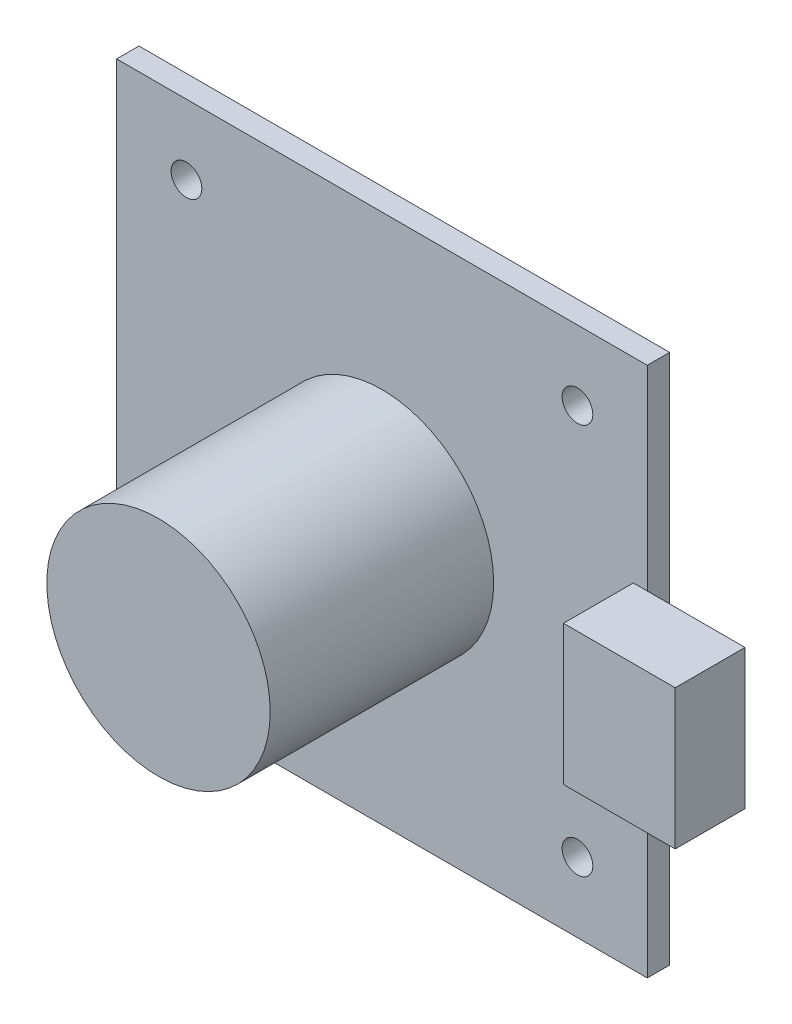
ISO-10303-21;
HEADER;
FILE_DESCRIPTION(('STEP AP214'),'2;1');
FILE_NAME('part.step','',(''),(''),'','','');
FILE_SCHEMA(('AUTOMOTIVE_DESIGN { 1 0 10303 214 1 1 1 1 }'));
ENDSEC;
DATA;
#1=APPLICATION_CONTEXT('core data for automotive mechanical design processes');
#2=APPLICATION_PROTOCOL_DEFINITION('international standard','automotive_design',2000,#1);
#3=PRODUCT_CONTEXT('',#1,'mechanical');
#4=PRODUCT('Part','Part','',(#3));
#5=PRODUCT_RELATED_PRODUCT_CATEGORY('part','',(#4));
#6=PRODUCT_DEFINITION_FORMATION('','',#4);
#7=PRODUCT_DEFINITION_CONTEXT('part definition',#1,'design');
#8=PRODUCT_DEFINITION('design','',#6,#7);
#9=PRODUCT_DEFINITION_SHAPE('','',#8);
#10=(LENGTH_UNIT() NAMED_UNIT(*) SI_UNIT(.MILLI.,.METRE.));
#11=(NAMED_UNIT(*) PLANE_ANGLE_UNIT() SI_UNIT($,.RADIAN.));
#12=(NAMED_UNIT(*) SI_UNIT($,.STERADIAN.) SOLID_ANGLE_UNIT());
#13=UNCERTAINTY_MEASURE_WITH_UNIT(LENGTH_MEASURE(1.E-05),#10,'distance_accuracy_value','');
#14=(GEOMETRIC_REPRESENTATION_CONTEXT(3) GLOBAL_UNCERTAINTY_ASSIGNED_CONTEXT((#13)) GLOBAL_UNIT_ASSIGNED_CONTEXT((#10,
#11,#12)) REPRESENTATION_CONTEXT('',''));
#15=CARTESIAN_POINT('',(0.,0.,0.));
#16=DIRECTION('',(0.,0.,1.));
#17=DIRECTION('',(1.,0.,0.));
#18=AXIS2_PLACEMENT_3D('',#15,#16,#17);
#19=CARTESIAN_POINT('',(0.,0.,1.6));
#20=DIRECTION('',(0.,0.,1.));
#21=DIRECTION('',(1.,0.,0.));
#22=AXIS2_PLACEMENT_3D('',#19,#20,#21);
#23=PLANE('',#22);
#24=CARTESIAN_POINT('',(0.,0.,1.6));
#25=DIRECTION('',(0.,0.,1.));
#26=DIRECTION('',(1.,0.,0.));
#27=AXIS2_PLACEMENT_3D('',#24,#25,#26);
#28=CIRCLE('',#27,8.);
#29=CARTESIAN_POINT('',(8.,0.,1.6));
#30=VERTEX_POINT('',#29);
#31=EDGE_CURVE('E132',#30,#30,#28,.T.);
#32=ORIENTED_EDGE('',*,*,#31,.F.);
#33=EDGE_LOOP('',(#32));
#34=FACE_BOUND('',#33,.T.);
#35=CARTESIAN_POINT('',(14.,-14.,1.6));
#36=DIRECTION('',(0.,0.,1.));
#37=DIRECTION('',(1.,0.,0.));
#38=AXIS2_PLACEMENT_3D('',#35,#36,#37);
#39=CIRCLE('',#38,1.1);
#40=CARTESIAN_POINT('',(15.1,-14.,1.6));
#41=VERTEX_POINT('',#40);
#42=EDGE_CURVE('E150',#41,#41,#39,.T.);
#43=ORIENTED_EDGE('',*,*,#42,.F.);
#44=EDGE_LOOP('',(#43));
#45=FACE_BOUND('',#44,.T.);
#46=CARTESIAN_POINT('',(-14.,-14.,1.6));
#47=DIRECTION('',(0.,0.,1.));
#48=DIRECTION('',(1.,0.,0.));
#49=AXIS2_PLACEMENT_3D('',#46,#47,#48);
#50=CIRCLE('',#49,1.1);
#51=CARTESIAN_POINT('',(-12.9,-14.,1.6));
#52=VERTEX_POINT('',#51);
#53=EDGE_CURVE('E162',#52,#52,#50,.T.);
#54=ORIENTED_EDGE('',*,*,#53,.F.);
#55=EDGE_LOOP('',(#54));
#56=FACE_BOUND('',#55,.T.);
#57=CARTESIAN_POINT('',(-14.,14.,1.6));
#58=DIRECTION('',(0.,0.,1.));
#59=DIRECTION('',(1.,0.,0.));
#60=AXIS2_PLACEMENT_3D('',#57,#58,#59);
#61=CIRCLE('',#60,1.1);
#62=CARTESIAN_POINT('',(-12.9,14.,1.6));
#63=VERTEX_POINT('',#62);
#64=EDGE_CURVE('E156',#63,#63,#61,.T.);
#65=ORIENTED_EDGE('',*,*,#64,.F.);
#66=EDGE_LOOP('',(#65));
#67=FACE_BOUND('',#66,.T.);
#68=CARTESIAN_POINT('',(14.,14.,1.6));
#69=DIRECTION('',(0.,0.,1.));
#70=DIRECTION('',(1.,0.,0.));
#71=AXIS2_PLACEMENT_3D('',#68,#69,#70);
#72=CIRCLE('',#71,1.1);
#73=CARTESIAN_POINT('',(15.1,14.,1.6));
#74=VERTEX_POINT('',#73);
#75=EDGE_CURVE('E144',#74,#74,#72,.T.);
#76=ORIENTED_EDGE('',*,*,#75,.F.);
#77=EDGE_LOOP('',(#76));
#78=FACE_BOUND('',#77,.T.);
#79=DIRECTION('',(0.,1.,0.));
#80=VECTOR('',#79,1.);
#81=CARTESIAN_POINT('',(19.,-19.,1.6));
#82=LINE('',#81,#80);
#83=CARTESIAN_POINT('',(19.,-19.,1.6));
#84=VERTEX_POINT('',#83);
#85=CARTESIAN_POINT('',(19.,-5.,1.6));
#86=VERTEX_POINT('',#85);
#87=EDGE_CURVE('E175',#84,#86,#82,.T.);
#88=ORIENTED_EDGE('',*,*,#87,.T.);
#89=DIRECTION('',(1.,0.,0.));
#90=VECTOR('',#89,1.);
#91=CARTESIAN_POINT('',(18.,-5.,1.6));
#92=LINE('',#91,#90);
#93=CARTESIAN_POINT('',(18.,-5.,1.6));
#94=VERTEX_POINT('',#93);
#95=EDGE_CURVE('E54',#94,#86,#92,.T.);
#96=ORIENTED_EDGE('',*,*,#95,.F.);
#97=DIRECTION('',(0.,-1.,0.));
#98=VECTOR('',#97,1.);
#99=CARTESIAN_POINT('',(18.,5.,1.6));
#100=LINE('',#99,#98);
#101=CARTESIAN_POINT('',(18.,5.,1.6));
#102=VERTEX_POINT('',#101);
#103=EDGE_CURVE('E59',#102,#94,#100,.T.);
#104=ORIENTED_EDGE('',*,*,#103,.F.);
#105=DIRECTION('',(-1.,0.,0.));
#106=VECTOR('',#105,1.);
#107=CARTESIAN_POINT('',(26.,5.,1.6));
#108=LINE('',#107,#106);
#109=CARTESIAN_POINT('',(19.,5.,1.6));
#110=VERTEX_POINT('',#109);
#111=EDGE_CURVE('E212',#110,#102,#108,.T.);
#112=ORIENTED_EDGE('',*,*,#111,.F.);
#113=CARTESIAN_POINT('',(19.,19.,1.6));
#114=VERTEX_POINT('',#113);
#115=EDGE_CURVE('E174',#110,#114,#82,.T.);
#116=ORIENTED_EDGE('',*,*,#115,.T.);
#117=DIRECTION('',(-1.,0.,0.));
#118=VECTOR('',#117,1.);
#119=CARTESIAN_POINT('',(19.,19.,1.6));
#120=LINE('',#119,#118);
#121=CARTESIAN_POINT('',(-19.,19.,1.6));
#122=VERTEX_POINT('',#121);
#123=EDGE_CURVE('E177',#114,#122,#120,.T.);
#124=ORIENTED_EDGE('',*,*,#123,.T.);
#125=DIRECTION('',(0.,-1.,0.));
#126=VECTOR('',#125,1.);
#127=CARTESIAN_POINT('',(-19.,19.,1.6));
#128=LINE('',#127,#126);
#129=CARTESIAN_POINT('',(-19.,-19.,1.6));
#130=VERTEX_POINT('',#129);
#131=EDGE_CURVE('E168',#122,#130,#128,.T.);
#132=ORIENTED_EDGE('',*,*,#131,.T.);
#133=DIRECTION('',(1.,0.,0.));
#134=VECTOR('',#133,1.);
#135=CARTESIAN_POINT('',(-19.,-19.,1.6));
#136=LINE('',#135,#134);
#137=EDGE_CURVE('E171',#130,#84,#136,.T.);
#138=ORIENTED_EDGE('',*,*,#137,.T.);
#139=EDGE_LOOP('',(#88,#96,#104,#112,#116,#124,#132,#138));
#140=FACE_BOUND('',#139,.T.);
#141=ADVANCED_FACE('F39',(#34,#45,#56,#67,#78,#140),#23,.T.);
#142=CARTESIAN_POINT('',(0.,0.,0.));
#143=DIRECTION('',(0.,0.,1.));
#144=DIRECTION('',(1.,0.,0.));
#145=AXIS2_PLACEMENT_3D('',#142,#143,#144);
#146=PLANE('',#145);
#147=DIRECTION('',(0.,-1.,0.));
#148=VECTOR('',#147,1.);
#149=CARTESIAN_POINT('',(-19.,19.,0.));
#150=LINE('',#149,#148);
#151=CARTESIAN_POINT('',(-19.,19.,0.));
#152=VERTEX_POINT('',#151);
#153=CARTESIAN_POINT('',(-19.,-19.,0.));
#154=VERTEX_POINT('',#153);
#155=EDGE_CURVE('E165',#152,#154,#150,.T.);
#156=ORIENTED_EDGE('',*,*,#155,.F.);
#157=DIRECTION('',(-1.,0.,0.));
#158=VECTOR('',#157,1.);
#159=CARTESIAN_POINT('',(19.,19.,0.));
#160=LINE('',#159,#158);
#161=CARTESIAN_POINT('',(19.,19.,0.));
#162=VERTEX_POINT('',#161);
#163=EDGE_CURVE('E172',#162,#152,#160,.T.);
#164=ORIENTED_EDGE('',*,*,#163,.F.);
#165=DIRECTION('',(0.,1.,0.));
#166=VECTOR('',#165,1.);
#167=CARTESIAN_POINT('',(19.,-19.,0.));
#168=LINE('',#167,#166);
#169=CARTESIAN_POINT('',(19.,-19.,0.));
#170=VERTEX_POINT('',#169);
#171=EDGE_CURVE('E185',#170,#162,#168,.T.);
#172=ORIENTED_EDGE('',*,*,#171,.F.);
#173=DIRECTION('',(1.,0.,0.));
#174=VECTOR('',#173,1.);
#175=CARTESIAN_POINT('',(-19.,-19.,0.));
#176=LINE('',#175,#174);
#177=EDGE_CURVE('E183',#154,#170,#176,.T.);
#178=ORIENTED_EDGE('',*,*,#177,.F.);
#179=EDGE_LOOP('',(#156,#164,#172,#178));
#180=FACE_BOUND('',#179,.T.);
#181=CARTESIAN_POINT('',(-14.,-14.,0.));
#182=DIRECTION('',(0.,0.,1.));
#183=DIRECTION('',(1.,0.,0.));
#184=AXIS2_PLACEMENT_3D('',#181,#182,#183);
#185=CIRCLE('',#184,1.1);
#186=CARTESIAN_POINT('',(-12.9,-14.,0.));
#187=VERTEX_POINT('',#186);
#188=EDGE_CURVE('E159',#187,#187,#185,.T.);
#189=ORIENTED_EDGE('',*,*,#188,.T.);
#190=EDGE_LOOP('',(#189));
#191=FACE_BOUND('',#190,.T.);
#192=CARTESIAN_POINT('',(-14.,14.,0.));
#193=DIRECTION('',(0.,0.,1.));
#194=DIRECTION('',(1.,0.,0.));
#195=AXIS2_PLACEMENT_3D('',#192,#193,#194);
#196=CIRCLE('',#195,1.1);
#197=CARTESIAN_POINT('',(-12.9,14.,0.));
#198=VERTEX_POINT('',#197);
#199=EDGE_CURVE('E153',#198,#198,#196,.T.);
#200=ORIENTED_EDGE('',*,*,#199,.T.);
#201=EDGE_LOOP('',(#200));
#202=FACE_BOUND('',#201,.T.);
#203=CARTESIAN_POINT('',(14.,-14.,0.));
#204=DIRECTION('',(0.,0.,1.));
#205=DIRECTION('',(1.,0.,0.));
#206=AXIS2_PLACEMENT_3D('',#203,#204,#205);
#207=CIRCLE('',#206,1.1);
#208=CARTESIAN_POINT('',(15.1,-14.,0.));
#209=VERTEX_POINT('',#208);
#210=EDGE_CURVE('E147',#209,#209,#207,.T.);
#211=ORIENTED_EDGE('',*,*,#210,.T.);
#212=EDGE_LOOP('',(#211));
#213=FACE_BOUND('',#212,.T.);
#214=CARTESIAN_POINT('',(14.,14.,0.));
#215=DIRECTION('',(0.,0.,1.));
#216=DIRECTION('',(1.,0.,0.));
#217=AXIS2_PLACEMENT_3D('',#214,#215,#216);
#218=CIRCLE('',#217,1.1);
#219=CARTESIAN_POINT('',(15.1,14.,0.));
#220=VERTEX_POINT('',#219);
#221=EDGE_CURVE('E142',#220,#220,#218,.T.);
#222=ORIENTED_EDGE('',*,*,#221,.T.);
#223=EDGE_LOOP('',(#222));
#224=FACE_BOUND('',#223,.T.);
#225=ADVANCED_FACE('F203',(#180,#191,#202,#213,#224),#146,.F.);
#226=CARTESIAN_POINT('',(-19.,19.,1.6));
#227=DIRECTION('',(1.,0.,0.));
#228=DIRECTION('',(0.,0.,-1.));
#229=AXIS2_PLACEMENT_3D('',#226,#227,#228);
#230=PLANE('',#229);
#231=ORIENTED_EDGE('',*,*,#155,.T.);
#232=DIRECTION('',(0.,0.,-1.));
#233=VECTOR('',#232,1.);
#234=CARTESIAN_POINT('',(-19.,-19.,1.6));
#235=LINE('',#234,#233);
#236=EDGE_CURVE('E11',#130,#154,#235,.T.);
#237=ORIENTED_EDGE('',*,*,#236,.F.);
#238=ORIENTED_EDGE('',*,*,#131,.F.);
#239=DIRECTION('',(0.,0.,-1.));
#240=VECTOR('',#239,1.);
#241=CARTESIAN_POINT('',(-19.,19.,1.6));
#242=LINE('',#241,#240);
#243=EDGE_CURVE('E180',#122,#152,#242,.T.);
#244=ORIENTED_EDGE('',*,*,#243,.T.);
#245=EDGE_LOOP('',(#231,#237,#238,#244));
#246=FACE_BOUND('',#245,.T.);
#247=ADVANCED_FACE('F41',(#246),#230,.F.);
#248=CARTESIAN_POINT('',(-19.,-19.,1.6));
#249=DIRECTION('',(0.,1.,0.));
#250=DIRECTION('',(0.,0.,1.));
#251=AXIS2_PLACEMENT_3D('',#248,#249,#250);
#252=PLANE('',#251);
#253=ORIENTED_EDGE('',*,*,#177,.T.);
#254=DIRECTION('',(0.,0.,-1.));
#255=VECTOR('',#254,1.);
#256=CARTESIAN_POINT('',(19.,-19.,1.6));
#257=LINE('',#256,#255);
#258=EDGE_CURVE('E47',#84,#170,#257,.T.);
#259=ORIENTED_EDGE('',*,*,#258,.F.);
#260=ORIENTED_EDGE('',*,*,#137,.F.);
#261=ORIENTED_EDGE('',*,*,#236,.T.);
#262=EDGE_LOOP('',(#253,#259,#260,#261));
#263=FACE_BOUND('',#262,.T.);
#264=ADVANCED_FACE('F260',(#263),#252,.F.);
#265=CARTESIAN_POINT('',(19.,-19.,1.6));
#266=DIRECTION('',(-1.,0.,0.));
#267=DIRECTION('',(0.,0.,1.));
#268=AXIS2_PLACEMENT_3D('',#265,#266,#267);
#269=PLANE('',#268);
#270=ORIENTED_EDGE('',*,*,#171,.T.);
#271=DIRECTION('',(0.,0.,-1.));
#272=VECTOR('',#271,1.);
#273=CARTESIAN_POINT('',(19.,19.,1.6));
#274=LINE('',#273,#272);
#275=EDGE_CURVE('E190',#114,#162,#274,.T.);
#276=ORIENTED_EDGE('',*,*,#275,.F.);
#277=ORIENTED_EDGE('',*,*,#115,.F.);
#278=EDGE_CURVE('E178',#86,#110,#82,.T.);
#279=ORIENTED_EDGE('',*,*,#278,.F.);
#280=ORIENTED_EDGE('',*,*,#87,.F.);
#281=ORIENTED_EDGE('',*,*,#258,.T.);
#282=EDGE_LOOP('',(#270,#276,#277,#279,#280,#281));
#283=FACE_BOUND('',#282,.T.);
#284=ADVANCED_FACE('F197',(#283),#269,.F.);
#285=CARTESIAN_POINT('',(19.,19.,1.6));
#286=DIRECTION('',(0.,-1.,0.));
#287=DIRECTION('',(0.,0.,-1.));
#288=AXIS2_PLACEMENT_3D('',#285,#286,#287);
#289=PLANE('',#288);
#290=ORIENTED_EDGE('',*,*,#163,.T.);
#291=ORIENTED_EDGE('',*,*,#243,.F.);
#292=ORIENTED_EDGE('',*,*,#123,.F.);
#293=ORIENTED_EDGE('',*,*,#275,.T.);
#294=EDGE_LOOP('',(#290,#291,#292,#293));
#295=FACE_BOUND('',#294,.T.);
#296=ADVANCED_FACE('F207',(#295),#289,.F.);
#297=CARTESIAN_POINT('',(-14.,-14.,1.6));
#298=DIRECTION('',(0.,0.,-1.));
#299=DIRECTION('',(-1.,0.,0.));
#300=AXIS2_PLACEMENT_3D('',#297,#298,#299);
#301=CYLINDRICAL_SURFACE('',#300,1.1);
#302=ORIENTED_EDGE('',*,*,#53,.T.);
#303=EDGE_LOOP('',(#302));
#304=FACE_BOUND('',#303,.T.);
#305=ORIENTED_EDGE('',*,*,#188,.F.);
#306=EDGE_LOOP('',(#305));
#307=FACE_BOUND('',#306,.T.);
#308=ADVANCED_FACE('F254',(#304,#307),#301,.F.);
#309=CARTESIAN_POINT('',(-14.,14.,1.6));
#310=DIRECTION('',(0.,0.,-1.));
#311=DIRECTION('',(-1.,0.,0.));
#312=AXIS2_PLACEMENT_3D('',#309,#310,#311);
#313=CYLINDRICAL_SURFACE('',#312,1.1);
#314=ORIENTED_EDGE('',*,*,#64,.T.);
#315=EDGE_LOOP('',(#314));
#316=FACE_BOUND('',#315,.T.);
#317=ORIENTED_EDGE('',*,*,#199,.F.);
#318=EDGE_LOOP('',(#317));
#319=FACE_BOUND('',#318,.T.);
#320=ADVANCED_FACE('F309',(#316,#319),#313,.F.);
#321=CARTESIAN_POINT('',(14.,-14.,1.6));
#322=DIRECTION('',(0.,0.,-1.));
#323=DIRECTION('',(-1.,0.,0.));
#324=AXIS2_PLACEMENT_3D('',#321,#322,#323);
#325=CYLINDRICAL_SURFACE('',#324,1.1);
#326=ORIENTED_EDGE('',*,*,#42,.T.);
#327=EDGE_LOOP('',(#326));
#328=FACE_BOUND('',#327,.T.);
#329=ORIENTED_EDGE('',*,*,#210,.F.);
#330=EDGE_LOOP('',(#329));
#331=FACE_BOUND('',#330,.T.);
#332=ADVANCED_FACE('F319',(#328,#331),#325,.F.);
#333=CARTESIAN_POINT('',(14.,14.,1.6));
#334=DIRECTION('',(0.,0.,-1.));
#335=DIRECTION('',(-1.,0.,0.));
#336=AXIS2_PLACEMENT_3D('',#333,#334,#335);
#337=CYLINDRICAL_SURFACE('',#336,1.1);
#338=ORIENTED_EDGE('',*,*,#75,.T.);
#339=EDGE_LOOP('',(#338));
#340=FACE_BOUND('',#339,.T.);
#341=ORIENTED_EDGE('',*,*,#221,.F.);
#342=EDGE_LOOP('',(#341));
#343=FACE_BOUND('',#342,.T.);
#344=ADVANCED_FACE('F329',(#340,#343),#337,.F.);
#345=CARTESIAN_POINT('',(0.,0.,17.6));
#346=DIRECTION('',(0.,0.,-1.));
#347=DIRECTION('',(-1.,0.,0.));
#348=AXIS2_PLACEMENT_3D('',#345,#346,#347);
#349=CYLINDRICAL_SURFACE('',#348,8.);
#350=CARTESIAN_POINT('',(0.,0.,17.6));
#351=DIRECTION('',(0.,0.,1.));
#352=DIRECTION('',(1.,0.,0.));
#353=AXIS2_PLACEMENT_3D('',#350,#351,#352);
#354=CIRCLE('',#353,8.);
#355=CARTESIAN_POINT('',(8.,0.,17.6));
#356=VERTEX_POINT('',#355);
#357=EDGE_CURVE('E135',#356,#356,#354,.T.);
#358=ORIENTED_EDGE('',*,*,#357,.F.);
#359=EDGE_LOOP('',(#358));
#360=FACE_BOUND('',#359,.T.);
#361=ORIENTED_EDGE('',*,*,#31,.T.);
#362=EDGE_LOOP('',(#361));
#363=FACE_BOUND('',#362,.T.);
#364=ADVANCED_FACE('F340',(#360,#363),#349,.T.);
#365=CARTESIAN_POINT('',(0.,0.,17.6));
#366=DIRECTION('',(0.,0.,1.));
#367=DIRECTION('',(1.,0.,0.));
#368=AXIS2_PLACEMENT_3D('',#365,#366,#367);
#369=PLANE('',#368);
#370=ORIENTED_EDGE('',*,*,#357,.T.);
#371=EDGE_LOOP('',(#370));
#372=FACE_BOUND('',#371,.T.);
#373=ADVANCED_FACE('F351',(#372),#369,.T.);
#374=CARTESIAN_POINT('',(0.,0.,1.6));
#375=DIRECTION('',(0.,0.,1.));
#376=DIRECTION('',(1.,0.,0.));
#377=AXIS2_PLACEMENT_3D('',#374,#375,#376);
#378=PLANE('',#377);
#379=CARTESIAN_POINT('',(26.,-5.,1.6));
#380=VERTEX_POINT('',#379);
#381=EDGE_CURVE('E220',#86,#380,#92,.T.);
#382=ORIENTED_EDGE('',*,*,#381,.F.);
#383=ORIENTED_EDGE('',*,*,#278,.T.);
#384=CARTESIAN_POINT('',(26.,5.,1.6));
#385=VERTEX_POINT('',#384);
#386=EDGE_CURVE('E129',#385,#110,#108,.T.);
#387=ORIENTED_EDGE('',*,*,#386,.F.);
#388=DIRECTION('',(0.,1.,0.));
#389=VECTOR('',#388,1.);
#390=CARTESIAN_POINT('',(26.,-5.,1.6));
#391=LINE('',#390,#389);
#392=EDGE_CURVE('E226',#380,#385,#391,.T.);
#393=ORIENTED_EDGE('',*,*,#392,.F.);
#394=EDGE_LOOP('',(#382,#383,#387,#393));
#395=FACE_BOUND('',#394,.T.);
#396=ADVANCED_FACE('F218',(#395),#378,.F.);
#397=CARTESIAN_POINT('',(18.,5.,6.6));
#398=DIRECTION('',(1.,0.,0.));
#399=DIRECTION('',(0.,0.,-1.));
#400=AXIS2_PLACEMENT_3D('',#397,#398,#399);
#401=PLANE('',#400);
#402=ORIENTED_EDGE('',*,*,#103,.T.);
#403=DIRECTION('',(0.,0.,-1.));
#404=VECTOR('',#403,1.);
#405=CARTESIAN_POINT('',(18.,-5.,6.6));
#406=LINE('',#405,#404);
#407=CARTESIAN_POINT('',(18.,-5.,6.6));
#408=VERTEX_POINT('',#407);
#409=EDGE_CURVE('E114',#408,#94,#406,.T.);
#410=ORIENTED_EDGE('',*,*,#409,.F.);
#411=DIRECTION('',(0.,-1.,0.));
#412=VECTOR('',#411,1.);
#413=CARTESIAN_POINT('',(18.,5.,6.6));
#414=LINE('',#413,#412);
#415=CARTESIAN_POINT('',(18.,5.,6.6));
#416=VERTEX_POINT('',#415);
#417=EDGE_CURVE('E120',#416,#408,#414,.T.);
#418=ORIENTED_EDGE('',*,*,#417,.F.);
#419=DIRECTION('',(0.,0.,-1.));
#420=VECTOR('',#419,1.);
#421=CARTESIAN_POINT('',(18.,5.,6.6));
#422=LINE('',#421,#420);
#423=EDGE_CURVE('E230',#416,#102,#422,.T.);
#424=ORIENTED_EDGE('',*,*,#423,.T.);
#425=EDGE_LOOP('',(#402,#410,#418,#424));
#426=FACE_BOUND('',#425,.T.);
#427=ADVANCED_FACE('F131',(#426),#401,.F.);
#428=CARTESIAN_POINT('',(18.,-5.,6.6));
#429=DIRECTION('',(0.,1.,0.));
#430=DIRECTION('',(0.,0.,1.));
#431=AXIS2_PLACEMENT_3D('',#428,#429,#430);
#432=PLANE('',#431);
#433=ORIENTED_EDGE('',*,*,#95,.T.);
#434=ORIENTED_EDGE('',*,*,#381,.T.);
#435=DIRECTION('',(0.,0.,-1.));
#436=VECTOR('',#435,1.);
#437=CARTESIAN_POINT('',(26.,-5.,6.6));
#438=LINE('',#437,#436);
#439=CARTESIAN_POINT('',(26.,-5.,6.6));
#440=VERTEX_POINT('',#439);
#441=EDGE_CURVE('E116',#440,#380,#438,.T.);
#442=ORIENTED_EDGE('',*,*,#441,.F.);
#443=DIRECTION('',(1.,0.,0.));
#444=VECTOR('',#443,1.);
#445=CARTESIAN_POINT('',(18.,-5.,6.6));
#446=LINE('',#445,#444);
#447=EDGE_CURVE('E110',#408,#440,#446,.T.);
#448=ORIENTED_EDGE('',*,*,#447,.F.);
#449=ORIENTED_EDGE('',*,*,#409,.T.);
#450=EDGE_LOOP('',(#433,#434,#442,#448,#449));
#451=FACE_BOUND('',#450,.T.);
#452=ADVANCED_FACE('F112',(#451),#432,.F.);
#453=CARTESIAN_POINT('',(26.,-5.,6.6));
#454=DIRECTION('',(-1.,0.,0.));
#455=DIRECTION('',(0.,0.,1.));
#456=AXIS2_PLACEMENT_3D('',#453,#454,#455);
#457=PLANE('',#456);
#458=ORIENTED_EDGE('',*,*,#392,.T.);
#459=DIRECTION('',(0.,0.,-1.));
#460=VECTOR('',#459,1.);
#461=CARTESIAN_POINT('',(26.,5.,6.6));
#462=LINE('',#461,#460);
#463=CARTESIAN_POINT('',(26.,5.,6.6));
#464=VERTEX_POINT('',#463);
#465=EDGE_CURVE('E137',#464,#385,#462,.T.);
#466=ORIENTED_EDGE('',*,*,#465,.F.);
#467=DIRECTION('',(0.,1.,0.));
#468=VECTOR('',#467,1.);
#469=CARTESIAN_POINT('',(26.,-5.,6.6));
#470=LINE('',#469,#468);
#471=EDGE_CURVE('E119',#440,#464,#470,.T.);
#472=ORIENTED_EDGE('',*,*,#471,.F.);
#473=ORIENTED_EDGE('',*,*,#441,.T.);
#474=EDGE_LOOP('',(#458,#466,#472,#473));
#475=FACE_BOUND('',#474,.T.);
#476=ADVANCED_FACE('F235',(#475),#457,.F.);
#477=CARTESIAN_POINT('',(26.,5.,6.6));
#478=DIRECTION('',(0.,-1.,0.));
#479=DIRECTION('',(0.,0.,-1.));
#480=AXIS2_PLACEMENT_3D('',#477,#478,#479);
#481=PLANE('',#480);
#482=ORIENTED_EDGE('',*,*,#386,.T.);
#483=ORIENTED_EDGE('',*,*,#111,.T.);
#484=ORIENTED_EDGE('',*,*,#423,.F.);
#485=DIRECTION('',(-1.,0.,0.));
#486=VECTOR('',#485,1.);
#487=CARTESIAN_POINT('',(26.,5.,6.6));
#488=LINE('',#487,#486);
#489=EDGE_CURVE('E125',#464,#416,#488,.T.);
#490=ORIENTED_EDGE('',*,*,#489,.F.);
#491=ORIENTED_EDGE('',*,*,#465,.T.);
#492=EDGE_LOOP('',(#482,#483,#484,#490,#491));
#493=FACE_BOUND('',#492,.T.);
#494=ADVANCED_FACE('F223',(#493),#481,.F.);
#495=CARTESIAN_POINT('',(0.,0.,6.6));
#496=DIRECTION('',(0.,0.,1.));
#497=DIRECTION('',(1.,0.,0.));
#498=AXIS2_PLACEMENT_3D('',#495,#496,#497);
#499=PLANE('',#498);
#500=ORIENTED_EDGE('',*,*,#417,.T.);
#501=ORIENTED_EDGE('',*,*,#447,.T.);
#502=ORIENTED_EDGE('',*,*,#471,.T.);
#503=ORIENTED_EDGE('',*,*,#489,.T.);
#504=EDGE_LOOP('',(#500,#501,#502,#503));
#505=FACE_BOUND('',#504,.T.);
#506=ADVANCED_FACE('F123',(#505),#499,.T.);
#507=CLOSED_SHELL('',(#141,#225,#247,#264,#284,#296,#308,#320,#332,#344,#364,#373,#396,#427,
#452,#476,#494,#506));
#508=MANIFOLD_SOLID_BREP('B2',#507);
#509=ADVANCED_BREP_SHAPE_REPRESENTATION('',(#18,#508),#14);
#510=SHAPE_DEFINITION_REPRESENTATION(#9,#509);
ENDSEC;
END-ISO-10303-21;
